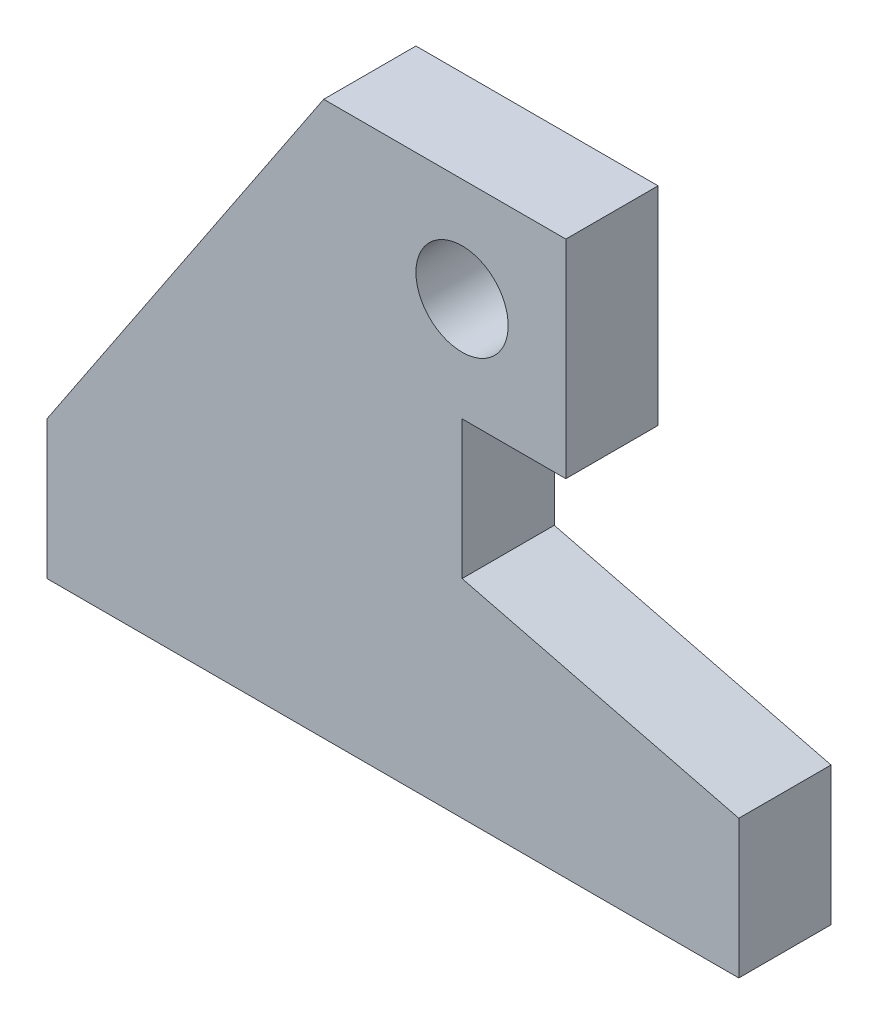
ISO-10303-21;
HEADER;
FILE_DESCRIPTION(('STEP AP214'),'2;1');
FILE_NAME('part.step','',(''),(''),'','','');
FILE_SCHEMA(('AUTOMOTIVE_DESIGN { 1 0 10303 214 1 1 1 1 }'));
ENDSEC;
DATA;
#1=APPLICATION_CONTEXT('core data for automotive mechanical design processes');
#2=APPLICATION_PROTOCOL_DEFINITION('international standard','automotive_design',2000,#1);
#3=PRODUCT_CONTEXT('',#1,'mechanical');
#4=PRODUCT('Part','Part','',(#3));
#5=PRODUCT_RELATED_PRODUCT_CATEGORY('part','',(#4));
#6=PRODUCT_DEFINITION_FORMATION('','',#4);
#7=PRODUCT_DEFINITION_CONTEXT('part definition',#1,'design');
#8=PRODUCT_DEFINITION('design','',#6,#7);
#9=PRODUCT_DEFINITION_SHAPE('','',#8);
#10=(LENGTH_UNIT() NAMED_UNIT(*) SI_UNIT(.MILLI.,.METRE.));
#11=(NAMED_UNIT(*) PLANE_ANGLE_UNIT() SI_UNIT($,.RADIAN.));
#12=(NAMED_UNIT(*) SI_UNIT($,.STERADIAN.) SOLID_ANGLE_UNIT());
#13=UNCERTAINTY_MEASURE_WITH_UNIT(LENGTH_MEASURE(1.E-05),#10,'distance_accuracy_value','');
#14=(GEOMETRIC_REPRESENTATION_CONTEXT(3) GLOBAL_UNCERTAINTY_ASSIGNED_CONTEXT((#13)) GLOBAL_UNIT_ASSIGNED_CONTEXT((#10,
#11,#12)) REPRESENTATION_CONTEXT('',''));
#15=CARTESIAN_POINT('',(0.,0.,0.));
#16=DIRECTION('',(0.,0.,1.));
#17=DIRECTION('',(1.,0.,0.));
#18=AXIS2_PLACEMENT_3D('',#15,#16,#17);
#19=CARTESIAN_POINT('',(76.2,28.575,12.7));
#20=DIRECTION('',(0.,0.,-1.));
#21=DIRECTION('',(-1.,0.,0.));
#22=AXIS2_PLACEMENT_3D('',#19,#20,#21);
#23=PLANE('',#22);
#24=DIRECTION('',(-1.,0.,0.));
#25=VECTOR('',#24,1.);
#26=CARTESIAN_POINT('',(-38.1000000000001,28.575,12.7));
#27=LINE('',#26,#25);
#28=CARTESIAN_POINT('',(28.575,28.575,12.7));
#29=VERTEX_POINT('',#28);
#30=CARTESIAN_POINT('',(-38.1000000000001,28.575,12.7));
#31=VERTEX_POINT('',#30);
#32=EDGE_CURVE('E143',#29,#31,#27,.T.);
#33=ORIENTED_EDGE('',*,*,#32,.T.);
#34=DIRECTION('',(-0.554700196225229,-0.832050294337844,0.));
#35=VECTOR('',#34,1.);
#36=CARTESIAN_POINT('',(-38.1000000000001,28.575,12.7));
#37=LINE('',#36,#35);
#38=CARTESIAN_POINT('',(-114.3,-85.725,12.7));
#39=VERTEX_POINT('',#38);
#40=EDGE_CURVE('E118',#31,#39,#37,.T.);
#41=ORIENTED_EDGE('',*,*,#40,.T.);
#42=DIRECTION('',(0.,-1.,0.));
#43=VECTOR('',#42,1.);
#44=CARTESIAN_POINT('',(-114.3,-123.825,12.7));
#45=LINE('',#44,#43);
#46=CARTESIAN_POINT('',(-114.3,-123.825,12.7));
#47=VERTEX_POINT('',#46);
#48=EDGE_CURVE('E146',#39,#47,#45,.T.);
#49=ORIENTED_EDGE('',*,*,#48,.T.);
#50=DIRECTION('',(1.,0.,0.));
#51=VECTOR('',#50,1.);
#52=CARTESIAN_POINT('',(-114.3,-123.825,12.7));
#53=LINE('',#52,#51);
#54=CARTESIAN_POINT('',(76.2,-123.825,12.7));
#55=VERTEX_POINT('',#54);
#56=EDGE_CURVE('E148',#47,#55,#53,.T.);
#57=ORIENTED_EDGE('',*,*,#56,.T.);
#58=DIRECTION('',(0.,1.,0.));
#59=VECTOR('',#58,1.);
#60=CARTESIAN_POINT('',(76.2,-85.725,12.7));
#61=LINE('',#60,#59);
#62=CARTESIAN_POINT('',(76.2,-85.725,12.7));
#63=VERTEX_POINT('',#62);
#64=EDGE_CURVE('E150',#55,#63,#61,.T.);
#65=ORIENTED_EDGE('',*,*,#64,.T.);
#66=DIRECTION('',(-0.970142500145332,0.242535625036333,0.));
#67=VECTOR('',#66,1.);
#68=CARTESIAN_POINT('',(0.,-66.675,12.7));
#69=LINE('',#68,#67);
#70=CARTESIAN_POINT('',(0.,-66.675,12.7));
#71=VERTEX_POINT('',#70);
#72=EDGE_CURVE('E152',#63,#71,#69,.T.);
#73=ORIENTED_EDGE('',*,*,#72,.T.);
#74=DIRECTION('',(0.,1.,0.));
#75=VECTOR('',#74,1.);
#76=CARTESIAN_POINT('',(0.,-28.5750000000001,12.7));
#77=LINE('',#76,#75);
#78=CARTESIAN_POINT('',(0.,-28.5750000000001,12.7));
#79=VERTEX_POINT('',#78);
#80=EDGE_CURVE('E154',#71,#79,#77,.T.);
#81=ORIENTED_EDGE('',*,*,#80,.T.);
#82=DIRECTION('',(1.,0.,0.));
#83=VECTOR('',#82,1.);
#84=CARTESIAN_POINT('',(0.,-28.5750000000001,12.7));
#85=LINE('',#84,#83);
#86=CARTESIAN_POINT('',(28.575,-28.575,12.7));
#87=VERTEX_POINT('',#86);
#88=EDGE_CURVE('E53',#79,#87,#85,.T.);
#89=ORIENTED_EDGE('',*,*,#88,.T.);
#90=DIRECTION('',(0.,1.,0.));
#91=VECTOR('',#90,1.);
#92=CARTESIAN_POINT('',(28.575,-28.575,12.7));
#93=LINE('',#92,#91);
#94=EDGE_CURVE('E48',#87,#29,#93,.T.);
#95=ORIENTED_EDGE('',*,*,#94,.T.);
#96=EDGE_LOOP('',(#33,#41,#49,#57,#65,#73,#81,#89,#95));
#97=FACE_BOUND('',#96,.T.);
#98=CARTESIAN_POINT('',(0.,0.,12.7));
#99=DIRECTION('',(0.,0.,1.));
#100=DIRECTION('',(-1.,0.,0.));
#101=AXIS2_PLACEMENT_3D('',#98,#99,#100);
#102=CIRCLE('',#101,12.6999999999994);
#103=CARTESIAN_POINT('',(-12.6999999999994,0.,12.7));
#104=VERTEX_POINT('',#103);
#105=EDGE_CURVE('E123',#104,#104,#102,.T.);
#106=ORIENTED_EDGE('',*,*,#105,.F.);
#107=EDGE_LOOP('',(#106));
#108=FACE_BOUND('',#107,.T.);
#109=ADVANCED_FACE('F33',(#97,#108),#23,.F.);
#110=CARTESIAN_POINT('',(76.2,28.575,-12.7));
#111=DIRECTION('',(0.,0.,-1.));
#112=DIRECTION('',(-1.,0.,0.));
#113=AXIS2_PLACEMENT_3D('',#110,#111,#112);
#114=PLANE('',#113);
#115=DIRECTION('',(-1.,0.,0.));
#116=VECTOR('',#115,1.);
#117=CARTESIAN_POINT('',(-38.1000000000001,28.575,-12.7));
#118=LINE('',#117,#116);
#119=CARTESIAN_POINT('',(28.575,28.575,-12.7));
#120=VERTEX_POINT('',#119);
#121=CARTESIAN_POINT('',(-38.1000000000001,28.575,-12.7));
#122=VERTEX_POINT('',#121);
#123=EDGE_CURVE('E109',#120,#122,#118,.T.);
#124=ORIENTED_EDGE('',*,*,#123,.F.);
#125=DIRECTION('',(0.,1.,0.));
#126=VECTOR('',#125,1.);
#127=CARTESIAN_POINT('',(28.575,-28.575,-12.7));
#128=LINE('',#127,#126);
#129=CARTESIAN_POINT('',(28.575,-28.575,-12.7));
#130=VERTEX_POINT('',#129);
#131=EDGE_CURVE('E141',#130,#120,#128,.T.);
#132=ORIENTED_EDGE('',*,*,#131,.F.);
#133=DIRECTION('',(1.,0.,0.));
#134=VECTOR('',#133,1.);
#135=CARTESIAN_POINT('',(0.,-28.5750000000001,-12.7));
#136=LINE('',#135,#134);
#137=CARTESIAN_POINT('',(0.,-28.5750000000001,-12.7));
#138=VERTEX_POINT('',#137);
#139=EDGE_CURVE('E139',#138,#130,#136,.T.);
#140=ORIENTED_EDGE('',*,*,#139,.F.);
#141=DIRECTION('',(0.,1.,0.));
#142=VECTOR('',#141,1.);
#143=CARTESIAN_POINT('',(0.,-28.5750000000001,-12.7));
#144=LINE('',#143,#142);
#145=CARTESIAN_POINT('',(0.,-66.675,-12.7));
#146=VERTEX_POINT('',#145);
#147=EDGE_CURVE('E137',#146,#138,#144,.T.);
#148=ORIENTED_EDGE('',*,*,#147,.F.);
#149=DIRECTION('',(-0.970142500145332,0.242535625036333,0.));
#150=VECTOR('',#149,1.);
#151=CARTESIAN_POINT('',(0.,-66.675,-12.7));
#152=LINE('',#151,#150);
#153=CARTESIAN_POINT('',(76.2,-85.725,-12.7));
#154=VERTEX_POINT('',#153);
#155=EDGE_CURVE('E135',#154,#146,#152,.T.);
#156=ORIENTED_EDGE('',*,*,#155,.F.);
#157=DIRECTION('',(0.,1.,0.));
#158=VECTOR('',#157,1.);
#159=CARTESIAN_POINT('',(76.2,-85.725,-12.7));
#160=LINE('',#159,#158);
#161=CARTESIAN_POINT('',(76.2,-123.825,-12.7));
#162=VERTEX_POINT('',#161);
#163=EDGE_CURVE('E133',#162,#154,#160,.T.);
#164=ORIENTED_EDGE('',*,*,#163,.F.);
#165=DIRECTION('',(1.,0.,0.));
#166=VECTOR('',#165,1.);
#167=CARTESIAN_POINT('',(-114.3,-123.825,-12.7));
#168=LINE('',#167,#166);
#169=CARTESIAN_POINT('',(-114.3,-123.825,-12.7));
#170=VERTEX_POINT('',#169);
#171=EDGE_CURVE('E131',#170,#162,#168,.T.);
#172=ORIENTED_EDGE('',*,*,#171,.F.);
#173=DIRECTION('',(0.,-1.,0.));
#174=VECTOR('',#173,1.);
#175=CARTESIAN_POINT('',(-114.3,-123.825,-12.7));
#176=LINE('',#175,#174);
#177=CARTESIAN_POINT('',(-114.3,-85.725,-12.7));
#178=VERTEX_POINT('',#177);
#179=EDGE_CURVE('E111',#178,#170,#176,.T.);
#180=ORIENTED_EDGE('',*,*,#179,.F.);
#181=DIRECTION('',(-0.554700196225229,-0.832050294337844,0.));
#182=VECTOR('',#181,1.);
#183=CARTESIAN_POINT('',(-38.1000000000001,28.575,-12.7));
#184=LINE('',#183,#182);
#185=EDGE_CURVE('E104',#122,#178,#184,.T.);
#186=ORIENTED_EDGE('',*,*,#185,.F.);
#187=EDGE_LOOP('',(#124,#132,#140,#148,#156,#164,#172,#180,#186));
#188=FACE_BOUND('',#187,.T.);
#189=CARTESIAN_POINT('',(0.,0.,-12.7));
#190=DIRECTION('',(0.,0.,1.));
#191=DIRECTION('',(-1.,0.,0.));
#192=AXIS2_PLACEMENT_3D('',#189,#190,#191);
#193=CIRCLE('',#192,12.6999999999994);
#194=CARTESIAN_POINT('',(-12.6999999999994,0.,-12.7));
#195=VERTEX_POINT('',#194);
#196=EDGE_CURVE('E126',#195,#195,#193,.T.);
#197=ORIENTED_EDGE('',*,*,#196,.T.);
#198=EDGE_LOOP('',(#197));
#199=FACE_BOUND('',#198,.T.);
#200=ADVANCED_FACE('F105',(#188,#199),#114,.T.);
#201=CARTESIAN_POINT('',(-38.1000000000001,28.575,12.7));
#202=DIRECTION('',(0.,-1.,0.));
#203=DIRECTION('',(1.,0.,0.));
#204=AXIS2_PLACEMENT_3D('',#201,#202,#203);
#205=PLANE('',#204);
#206=ORIENTED_EDGE('',*,*,#123,.T.);
#207=DIRECTION('',(0.,0.,-1.));
#208=VECTOR('',#207,1.);
#209=CARTESIAN_POINT('',(-38.1000000000001,28.575,12.7));
#210=LINE('',#209,#208);
#211=EDGE_CURVE('E11',#31,#122,#210,.T.);
#212=ORIENTED_EDGE('',*,*,#211,.F.);
#213=ORIENTED_EDGE('',*,*,#32,.F.);
#214=DIRECTION('',(0.,0.,-1.));
#215=VECTOR('',#214,1.);
#216=CARTESIAN_POINT('',(28.575,28.575,12.7));
#217=LINE('',#216,#215);
#218=EDGE_CURVE('E122',#29,#120,#217,.T.);
#219=ORIENTED_EDGE('',*,*,#218,.T.);
#220=EDGE_LOOP('',(#206,#212,#213,#219));
#221=FACE_BOUND('',#220,.T.);
#222=ADVANCED_FACE('F35',(#221),#205,.F.);
#223=CARTESIAN_POINT('',(-38.1000000000001,28.575,12.7));
#224=DIRECTION('',(0.832050294337844,-0.554700196225229,0.));
#225=DIRECTION('',(0.554700196225229,0.832050294337844,0.));
#226=AXIS2_PLACEMENT_3D('',#223,#224,#225);
#227=PLANE('',#226);
#228=ORIENTED_EDGE('',*,*,#185,.T.);
#229=DIRECTION('',(0.,0.,-1.));
#230=VECTOR('',#229,1.);
#231=CARTESIAN_POINT('',(-114.3,-85.725,12.7));
#232=LINE('',#231,#230);
#233=EDGE_CURVE('E41',#39,#178,#232,.T.);
#234=ORIENTED_EDGE('',*,*,#233,.F.);
#235=ORIENTED_EDGE('',*,*,#40,.F.);
#236=ORIENTED_EDGE('',*,*,#211,.T.);
#237=EDGE_LOOP('',(#228,#234,#235,#236));
#238=FACE_BOUND('',#237,.T.);
#239=ADVANCED_FACE('F117',(#238),#227,.F.);
#240=CARTESIAN_POINT('',(-114.3,-123.825,12.7));
#241=DIRECTION('',(1.,0.,0.));
#242=DIRECTION('',(0.,0.,-1.));
#243=AXIS2_PLACEMENT_3D('',#240,#241,#242);
#244=PLANE('',#243);
#245=ORIENTED_EDGE('',*,*,#179,.T.);
#246=DIRECTION('',(0.,0.,-1.));
#247=VECTOR('',#246,1.);
#248=CARTESIAN_POINT('',(-114.3,-123.825,12.7));
#249=LINE('',#248,#247);
#250=EDGE_CURVE('E174',#47,#170,#249,.T.);
#251=ORIENTED_EDGE('',*,*,#250,.F.);
#252=ORIENTED_EDGE('',*,*,#48,.F.);
#253=ORIENTED_EDGE('',*,*,#233,.T.);
#254=EDGE_LOOP('',(#245,#251,#252,#253));
#255=FACE_BOUND('',#254,.T.);
#256=ADVANCED_FACE('F178',(#255),#244,.F.);
#257=CARTESIAN_POINT('',(-114.3,-123.825,12.7));
#258=DIRECTION('',(0.,1.,0.));
#259=DIRECTION('',(0.,0.,1.));
#260=AXIS2_PLACEMENT_3D('',#257,#258,#259);
#261=PLANE('',#260);
#262=ORIENTED_EDGE('',*,*,#171,.T.);
#263=DIRECTION('',(0.,0.,-1.));
#264=VECTOR('',#263,1.);
#265=CARTESIAN_POINT('',(76.2,-123.825,12.7));
#266=LINE('',#265,#264);
#267=EDGE_CURVE('E171',#55,#162,#266,.T.);
#268=ORIENTED_EDGE('',*,*,#267,.F.);
#269=ORIENTED_EDGE('',*,*,#56,.F.);
#270=ORIENTED_EDGE('',*,*,#250,.T.);
#271=EDGE_LOOP('',(#262,#268,#269,#270));
#272=FACE_BOUND('',#271,.T.);
#273=ADVANCED_FACE('F186',(#272),#261,.F.);
#274=CARTESIAN_POINT('',(76.2,-85.725,12.7));
#275=DIRECTION('',(-1.,0.,0.));
#276=DIRECTION('',(0.,0.,1.));
#277=AXIS2_PLACEMENT_3D('',#274,#275,#276);
#278=PLANE('',#277);
#279=ORIENTED_EDGE('',*,*,#163,.T.);
#280=DIRECTION('',(0.,0.,-1.));
#281=VECTOR('',#280,1.);
#282=CARTESIAN_POINT('',(76.2,-85.725,12.7));
#283=LINE('',#282,#281);
#284=EDGE_CURVE('E168',#63,#154,#283,.T.);
#285=ORIENTED_EDGE('',*,*,#284,.F.);
#286=ORIENTED_EDGE('',*,*,#64,.F.);
#287=ORIENTED_EDGE('',*,*,#267,.T.);
#288=EDGE_LOOP('',(#279,#285,#286,#287));
#289=FACE_BOUND('',#288,.T.);
#290=ADVANCED_FACE('F189',(#289),#278,.F.);
#291=CARTESIAN_POINT('',(0.,-66.675,12.7));
#292=DIRECTION('',(-0.242535625036333,-0.970142500145332,0.));
#293=DIRECTION('',(0.970142500145332,-0.242535625036333,0.));
#294=AXIS2_PLACEMENT_3D('',#291,#292,#293);
#295=PLANE('',#294);
#296=ORIENTED_EDGE('',*,*,#155,.T.);
#297=DIRECTION('',(0.,0.,-1.));
#298=VECTOR('',#297,1.);
#299=CARTESIAN_POINT('',(0.,-66.675,12.7));
#300=LINE('',#299,#298);
#301=EDGE_CURVE('E165',#71,#146,#300,.T.);
#302=ORIENTED_EDGE('',*,*,#301,.F.);
#303=ORIENTED_EDGE('',*,*,#72,.F.);
#304=ORIENTED_EDGE('',*,*,#284,.T.);
#305=EDGE_LOOP('',(#296,#302,#303,#304));
#306=FACE_BOUND('',#305,.T.);
#307=ADVANCED_FACE('F194',(#306),#295,.F.);
#308=CARTESIAN_POINT('',(0.,-28.5750000000001,12.7));
#309=DIRECTION('',(-1.,0.,0.));
#310=DIRECTION('',(0.,-1.,0.));
#311=AXIS2_PLACEMENT_3D('',#308,#309,#310);
#312=PLANE('',#311);
#313=ORIENTED_EDGE('',*,*,#147,.T.);
#314=DIRECTION('',(0.,0.,-1.));
#315=VECTOR('',#314,1.);
#316=CARTESIAN_POINT('',(0.,-28.5750000000001,12.7));
#317=LINE('',#316,#315);
#318=EDGE_CURVE('E162',#79,#138,#317,.T.);
#319=ORIENTED_EDGE('',*,*,#318,.F.);
#320=ORIENTED_EDGE('',*,*,#80,.F.);
#321=ORIENTED_EDGE('',*,*,#301,.T.);
#322=EDGE_LOOP('',(#313,#319,#320,#321));
#323=FACE_BOUND('',#322,.T.);
#324=ADVANCED_FACE('F198',(#323),#312,.F.);
#325=CARTESIAN_POINT('',(0.,-28.5750000000001,12.7));
#326=DIRECTION('',(0.,1.,0.));
#327=DIRECTION('',(-1.,0.,0.));
#328=AXIS2_PLACEMENT_3D('',#325,#326,#327);
#329=PLANE('',#328);
#330=ORIENTED_EDGE('',*,*,#139,.T.);
#331=DIRECTION('',(0.,0.,-1.));
#332=VECTOR('',#331,1.);
#333=CARTESIAN_POINT('',(28.575,-28.575,12.7));
#334=LINE('',#333,#332);
#335=EDGE_CURVE('E159',#87,#130,#334,.T.);
#336=ORIENTED_EDGE('',*,*,#335,.F.);
#337=ORIENTED_EDGE('',*,*,#88,.F.);
#338=ORIENTED_EDGE('',*,*,#318,.T.);
#339=EDGE_LOOP('',(#330,#336,#337,#338));
#340=FACE_BOUND('',#339,.T.);
#341=ADVANCED_FACE('F202',(#340),#329,.F.);
#342=CARTESIAN_POINT('',(28.575,-28.575,12.7));
#343=DIRECTION('',(-1.,0.,0.));
#344=DIRECTION('',(0.,-1.,0.));
#345=AXIS2_PLACEMENT_3D('',#342,#343,#344);
#346=PLANE('',#345);
#347=ORIENTED_EDGE('',*,*,#131,.T.);
#348=ORIENTED_EDGE('',*,*,#218,.F.);
#349=ORIENTED_EDGE('',*,*,#94,.F.);
#350=ORIENTED_EDGE('',*,*,#335,.T.);
#351=EDGE_LOOP('',(#347,#348,#349,#350));
#352=FACE_BOUND('',#351,.T.);
#353=ADVANCED_FACE('F204',(#352),#346,.F.);
#354=CARTESIAN_POINT('',(0.,0.,12.7));
#355=DIRECTION('',(0.,0.,-1.));
#356=DIRECTION('',(-1.,0.,0.));
#357=AXIS2_PLACEMENT_3D('',#354,#355,#356);
#358=CYLINDRICAL_SURFACE('',#357,12.6999999999994);
#359=ORIENTED_EDGE('',*,*,#105,.T.);
#360=EDGE_LOOP('',(#359));
#361=FACE_BOUND('',#360,.T.);
#362=ORIENTED_EDGE('',*,*,#196,.F.);
#363=EDGE_LOOP('',(#362));
#364=FACE_BOUND('',#363,.T.);
#365=ADVANCED_FACE('F206',(#361,#364),#358,.F.);
#366=CLOSED_SHELL('',(#109,#200,#222,#239,#256,#273,#290,#307,#324,#341,#353,#365));
#367=MANIFOLD_SOLID_BREP('B2',#366);
#368=ADVANCED_BREP_SHAPE_REPRESENTATION('',(#18,#367),#14);
#369=SHAPE_DEFINITION_REPRESENTATION(#9,#368);
ENDSEC;
END-ISO-10303-21;
